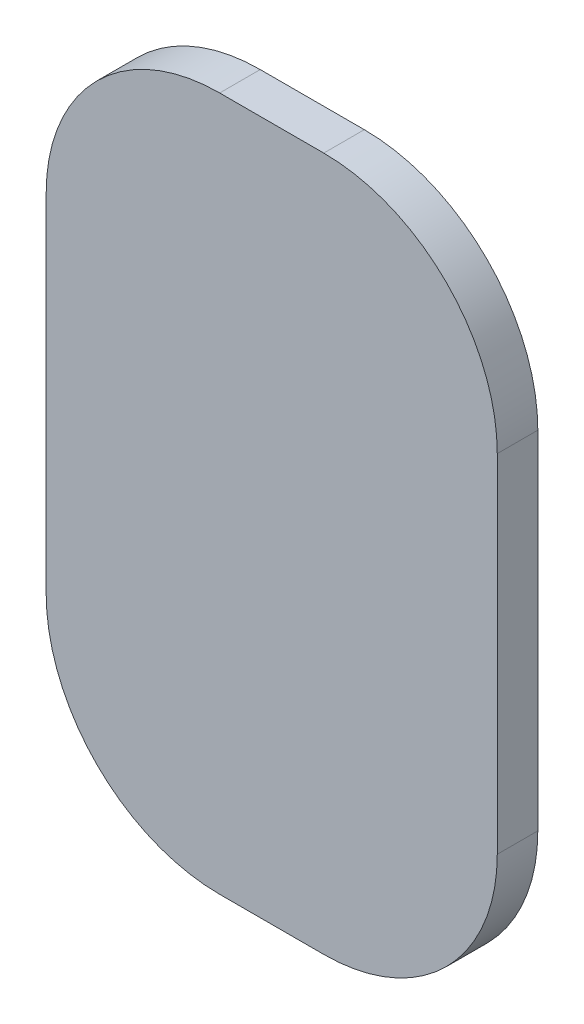
ISO-10303-21;
HEADER;
FILE_DESCRIPTION(('STEP AP214'),'2;1');
FILE_NAME('part.step','',(''),(''),'','','');
FILE_SCHEMA(('AUTOMOTIVE_DESIGN { 1 0 10303 214 1 1 1 1 }'));
ENDSEC;
DATA;
#1=APPLICATION_CONTEXT('core data for automotive mechanical design processes');
#2=APPLICATION_PROTOCOL_DEFINITION('international standard','automotive_design',2000,#1);
#3=PRODUCT_CONTEXT('',#1,'mechanical');
#4=PRODUCT('Part','Part','',(#3));
#5=PRODUCT_RELATED_PRODUCT_CATEGORY('part','',(#4));
#6=PRODUCT_DEFINITION_FORMATION('','',#4);
#7=PRODUCT_DEFINITION_CONTEXT('part definition',#1,'design');
#8=PRODUCT_DEFINITION('design','',#6,#7);
#9=PRODUCT_DEFINITION_SHAPE('','',#8);
#10=(LENGTH_UNIT() NAMED_UNIT(*) SI_UNIT(.MILLI.,.METRE.));
#11=(NAMED_UNIT(*) PLANE_ANGLE_UNIT() SI_UNIT($,.RADIAN.));
#12=(NAMED_UNIT(*) SI_UNIT($,.STERADIAN.) SOLID_ANGLE_UNIT());
#13=UNCERTAINTY_MEASURE_WITH_UNIT(LENGTH_MEASURE(1.E-05),#10,'distance_accuracy_value','');
#14=(GEOMETRIC_REPRESENTATION_CONTEXT(3) GLOBAL_UNCERTAINTY_ASSIGNED_CONTEXT((#13)) GLOBAL_UNIT_ASSIGNED_CONTEXT((#10,
#11,#12)) REPRESENTATION_CONTEXT('',''));
#15=CARTESIAN_POINT('',(0.,0.,0.));
#16=DIRECTION('',(0.,0.,1.));
#17=DIRECTION('',(1.,0.,0.));
#18=AXIS2_PLACEMENT_3D('',#15,#16,#17);
#19=CARTESIAN_POINT('',(0.,0.,-1.1684));
#20=DIRECTION('',(-1.,0.,0.));
#21=DIRECTION('',(0.,-1.,0.));
#22=AXIS2_PLACEMENT_3D('',#19,#20,#21);
#23=PLANE('',#22);
#24=DIRECTION('',(0.,-1.,0.));
#25=VECTOR('',#24,1.);
#26=CARTESIAN_POINT('',(0.,0.,0.));
#27=LINE('',#26,#25);
#28=CARTESIAN_POINT('',(0.,15.,0.));
#29=VERTEX_POINT('',#28);
#30=CARTESIAN_POINT('',(0.,5.,0.));
#31=VERTEX_POINT('',#30);
#32=EDGE_CURVE('E162',#29,#31,#27,.T.);
#33=ORIENTED_EDGE('',*,*,#32,.F.);
#34=DIRECTION('',(0.,0.,1.));
#35=VECTOR('',#34,1.);
#36=CARTESIAN_POINT('',(0.,15.,-1.1684));
#37=LINE('',#36,#35);
#38=CARTESIAN_POINT('',(0.,15.,-1.1684));
#39=VERTEX_POINT('',#38);
#40=EDGE_CURVE('E142',#29,#39,#37,.F.);
#41=ORIENTED_EDGE('',*,*,#40,.T.);
#42=DIRECTION('',(0.,-1.,0.));
#43=VECTOR('',#42,1.);
#44=CARTESIAN_POINT('',(0.,0.,-1.1684));
#45=LINE('',#44,#43);
#46=CARTESIAN_POINT('',(0.,5.,-1.1684));
#47=VERTEX_POINT('',#46);
#48=EDGE_CURVE('E123',#39,#47,#45,.T.);
#49=ORIENTED_EDGE('',*,*,#48,.T.);
#50=DIRECTION('',(0.,0.,1.));
#51=VECTOR('',#50,1.);
#52=CARTESIAN_POINT('',(0.,5.,-1.1684));
#53=LINE('',#52,#51);
#54=EDGE_CURVE('E139',#47,#31,#53,.T.);
#55=ORIENTED_EDGE('',*,*,#54,.T.);
#56=EDGE_LOOP('',(#33,#41,#49,#55));
#57=FACE_BOUND('',#56,.T.);
#58=ADVANCED_FACE('F37',(#57),#23,.T.);
#59=CARTESIAN_POINT('',(0.,20.,-1.1684));
#60=DIRECTION('',(0.,1.,0.));
#61=DIRECTION('',(0.,0.,1.));
#62=AXIS2_PLACEMENT_3D('',#59,#60,#61);
#63=PLANE('',#62);
#64=DIRECTION('',(-1.,0.,0.));
#65=VECTOR('',#64,1.);
#66=CARTESIAN_POINT('',(0.,20.,-1.1684));
#67=LINE('',#66,#65);
#68=CARTESIAN_POINT('',(7.99999999999999,20.,-1.1684));
#69=VERTEX_POINT('',#68);
#70=CARTESIAN_POINT('',(4.99999999999999,20.,-1.1684));
#71=VERTEX_POINT('',#70);
#72=EDGE_CURVE('E127',#69,#71,#67,.T.);
#73=ORIENTED_EDGE('',*,*,#72,.T.);
#74=DIRECTION('',(0.,0.,1.));
#75=VECTOR('',#74,1.);
#76=CARTESIAN_POINT('',(5.,20.,-1.1684));
#77=LINE('',#76,#75);
#78=CARTESIAN_POINT('',(4.99999999999999,20.,0.));
#79=VERTEX_POINT('',#78);
#80=EDGE_CURVE('E114',#71,#79,#77,.T.);
#81=ORIENTED_EDGE('',*,*,#80,.T.);
#82=DIRECTION('',(-1.,0.,0.));
#83=VECTOR('',#82,1.);
#84=CARTESIAN_POINT('',(0.,20.,0.));
#85=LINE('',#84,#83);
#86=CARTESIAN_POINT('',(7.99999999999999,20.,0.));
#87=VERTEX_POINT('',#86);
#88=EDGE_CURVE('E106',#87,#79,#85,.T.);
#89=ORIENTED_EDGE('',*,*,#88,.F.);
#90=DIRECTION('',(0.,0.,1.));
#91=VECTOR('',#90,1.);
#92=CARTESIAN_POINT('',(8.,20.,-1.1684));
#93=LINE('',#92,#91);
#94=EDGE_CURVE('E120',#87,#69,#93,.F.);
#95=ORIENTED_EDGE('',*,*,#94,.T.);
#96=EDGE_LOOP('',(#73,#81,#89,#95));
#97=FACE_BOUND('',#96,.T.);
#98=ADVANCED_FACE('F119',(#97),#63,.T.);
#99=CARTESIAN_POINT('',(13.,0.,-1.1684));
#100=DIRECTION('',(1.,0.,0.));
#101=DIRECTION('',(0.,1.,0.));
#102=AXIS2_PLACEMENT_3D('',#99,#100,#101);
#103=PLANE('',#102);
#104=DIRECTION('',(0.,1.,0.));
#105=VECTOR('',#104,1.);
#106=CARTESIAN_POINT('',(13.,0.,0.));
#107=LINE('',#106,#105);
#108=CARTESIAN_POINT('',(13.,5.,0.));
#109=VERTEX_POINT('',#108);
#110=CARTESIAN_POINT('',(13.,15.,0.));
#111=VERTEX_POINT('',#110);
#112=EDGE_CURVE('E108',#109,#111,#107,.T.);
#113=ORIENTED_EDGE('',*,*,#112,.F.);
#114=DIRECTION('',(0.,0.,1.));
#115=VECTOR('',#114,1.);
#116=CARTESIAN_POINT('',(13.,5.,-1.1684));
#117=LINE('',#116,#115);
#118=CARTESIAN_POINT('',(13.,5.,-1.1684));
#119=VERTEX_POINT('',#118);
#120=EDGE_CURVE('E11',#109,#119,#117,.F.);
#121=ORIENTED_EDGE('',*,*,#120,.T.);
#122=DIRECTION('',(0.,1.,0.));
#123=VECTOR('',#122,1.);
#124=CARTESIAN_POINT('',(13.,0.,-1.1684));
#125=LINE('',#124,#123);
#126=CARTESIAN_POINT('',(13.,15.,-1.1684));
#127=VERTEX_POINT('',#126);
#128=EDGE_CURVE('E130',#119,#127,#125,.T.);
#129=ORIENTED_EDGE('',*,*,#128,.T.);
#130=DIRECTION('',(0.,0.,1.));
#131=VECTOR('',#130,1.);
#132=CARTESIAN_POINT('',(13.,15.,-1.1684));
#133=LINE('',#132,#131);
#134=EDGE_CURVE('E45',#127,#111,#133,.T.);
#135=ORIENTED_EDGE('',*,*,#134,.T.);
#136=EDGE_LOOP('',(#113,#121,#129,#135));
#137=FACE_BOUND('',#136,.T.);
#138=ADVANCED_FACE('F155',(#137),#103,.T.);
#139=CARTESIAN_POINT('',(0.,0.,-1.1684));
#140=DIRECTION('',(0.,-1.,0.));
#141=DIRECTION('',(0.,0.,-1.));
#142=AXIS2_PLACEMENT_3D('',#139,#140,#141);
#143=PLANE('',#142);
#144=DIRECTION('',(1.,0.,0.));
#145=VECTOR('',#144,1.);
#146=CARTESIAN_POINT('',(0.,0.,0.));
#147=LINE('',#146,#145);
#148=CARTESIAN_POINT('',(5.,0.,0.));
#149=VERTEX_POINT('',#148);
#150=CARTESIAN_POINT('',(7.99999999999999,0.,0.));
#151=VERTEX_POINT('',#150);
#152=EDGE_CURVE('E165',#149,#151,#147,.T.);
#153=ORIENTED_EDGE('',*,*,#152,.F.);
#154=DIRECTION('',(0.,0.,1.));
#155=VECTOR('',#154,1.);
#156=CARTESIAN_POINT('',(5.,0.,-1.1684));
#157=LINE('',#156,#155);
#158=CARTESIAN_POINT('',(5.,0.,-1.1684));
#159=VERTEX_POINT('',#158);
#160=EDGE_CURVE('E59',#149,#159,#157,.F.);
#161=ORIENTED_EDGE('',*,*,#160,.T.);
#162=DIRECTION('',(1.,0.,0.));
#163=VECTOR('',#162,1.);
#164=CARTESIAN_POINT('',(0.,0.,-1.1684));
#165=LINE('',#164,#163);
#166=CARTESIAN_POINT('',(7.99999999999999,0.,-1.1684));
#167=VERTEX_POINT('',#166);
#168=EDGE_CURVE('E157',#159,#167,#165,.T.);
#169=ORIENTED_EDGE('',*,*,#168,.T.);
#170=DIRECTION('',(0.,0.,1.));
#171=VECTOR('',#170,1.);
#172=CARTESIAN_POINT('',(8.,0.,-1.1684));
#173=LINE('',#172,#171);
#174=EDGE_CURVE('E150',#167,#151,#173,.T.);
#175=ORIENTED_EDGE('',*,*,#174,.T.);
#176=EDGE_LOOP('',(#153,#161,#169,#175));
#177=FACE_BOUND('',#176,.T.);
#178=ADVANCED_FACE('F167',(#177),#143,.T.);
#179=CARTESIAN_POINT('',(0.,0.,-1.1684));
#180=DIRECTION('',(0.,0.,-1.));
#181=DIRECTION('',(-1.,0.,0.));
#182=AXIS2_PLACEMENT_3D('',#179,#180,#181);
#183=PLANE('',#182);
#184=ORIENTED_EDGE('',*,*,#48,.F.);
#185=CARTESIAN_POINT('',(5.,15.,-1.1684));
#186=DIRECTION('',(0.,0.,-1.));
#187=DIRECTION('',(-1.,0.,0.));
#188=AXIS2_PLACEMENT_3D('',#185,#186,#187);
#189=CIRCLE('',#188,5.);
#190=EDGE_CURVE('E148',#39,#71,#189,.T.);
#191=ORIENTED_EDGE('',*,*,#190,.T.);
#192=ORIENTED_EDGE('',*,*,#72,.F.);
#193=CARTESIAN_POINT('',(8.,15.,-1.1684));
#194=DIRECTION('',(0.,0.,-1.));
#195=DIRECTION('',(-1.,0.,0.));
#196=AXIS2_PLACEMENT_3D('',#193,#194,#195);
#197=CIRCLE('',#196,5.);
#198=EDGE_CURVE('E126',#69,#127,#197,.T.);
#199=ORIENTED_EDGE('',*,*,#198,.T.);
#200=ORIENTED_EDGE('',*,*,#128,.F.);
#201=CARTESIAN_POINT('',(8.,5.,-1.1684));
#202=DIRECTION('',(0.,0.,-1.));
#203=DIRECTION('',(-1.,0.,0.));
#204=AXIS2_PLACEMENT_3D('',#201,#202,#203);
#205=CIRCLE('',#204,5.);
#206=EDGE_CURVE('E52',#119,#167,#205,.T.);
#207=ORIENTED_EDGE('',*,*,#206,.T.);
#208=ORIENTED_EDGE('',*,*,#168,.F.);
#209=CARTESIAN_POINT('',(5.,5.,-1.1684));
#210=DIRECTION('',(0.,0.,-1.));
#211=DIRECTION('',(-1.,0.,0.));
#212=AXIS2_PLACEMENT_3D('',#209,#210,#211);
#213=CIRCLE('',#212,5.);
#214=EDGE_CURVE('E146',#159,#47,#213,.T.);
#215=ORIENTED_EDGE('',*,*,#214,.T.);
#216=EDGE_LOOP('',(#184,#191,#192,#199,#200,#207,#208,#215));
#217=FACE_BOUND('',#216,.T.);
#218=ADVANCED_FACE('F175',(#217),#183,.T.);
#219=CARTESIAN_POINT('',(0.,0.,0.));
#220=DIRECTION('',(0.,0.,-1.));
#221=DIRECTION('',(-1.,0.,0.));
#222=AXIS2_PLACEMENT_3D('',#219,#220,#221);
#223=PLANE('',#222);
#224=ORIENTED_EDGE('',*,*,#88,.T.);
#225=CARTESIAN_POINT('',(5.,15.,0.));
#226=DIRECTION('',(0.,0.,-1.));
#227=DIRECTION('',(-1.,0.,0.));
#228=AXIS2_PLACEMENT_3D('',#225,#226,#227);
#229=CIRCLE('',#228,5.);
#230=EDGE_CURVE('E137',#79,#29,#229,.F.);
#231=ORIENTED_EDGE('',*,*,#230,.T.);
#232=ORIENTED_EDGE('',*,*,#32,.T.);
#233=CARTESIAN_POINT('',(5.,5.,0.));
#234=DIRECTION('',(0.,0.,-1.));
#235=DIRECTION('',(-1.,0.,0.));
#236=AXIS2_PLACEMENT_3D('',#233,#234,#235);
#237=CIRCLE('',#236,5.);
#238=EDGE_CURVE('E135',#31,#149,#237,.F.);
#239=ORIENTED_EDGE('',*,*,#238,.T.);
#240=ORIENTED_EDGE('',*,*,#152,.T.);
#241=CARTESIAN_POINT('',(8.,5.,0.));
#242=DIRECTION('',(0.,0.,-1.));
#243=DIRECTION('',(-1.,0.,0.));
#244=AXIS2_PLACEMENT_3D('',#241,#242,#243);
#245=CIRCLE('',#244,5.);
#246=EDGE_CURVE('E113',#151,#109,#245,.F.);
#247=ORIENTED_EDGE('',*,*,#246,.T.);
#248=ORIENTED_EDGE('',*,*,#112,.T.);
#249=CARTESIAN_POINT('',(8.,15.,0.));
#250=DIRECTION('',(0.,0.,-1.));
#251=DIRECTION('',(-1.,0.,0.));
#252=AXIS2_PLACEMENT_3D('',#249,#250,#251);
#253=CIRCLE('',#252,5.);
#254=EDGE_CURVE('E103',#111,#87,#253,.F.);
#255=ORIENTED_EDGE('',*,*,#254,.T.);
#256=EDGE_LOOP('',(#224,#231,#232,#239,#240,#247,#248,#255));
#257=FACE_BOUND('',#256,.T.);
#258=ADVANCED_FACE('F105',(#257),#223,.F.);
#259=CARTESIAN_POINT('',(5.,15.,-1.1684));
#260=DIRECTION('',(0.,0.,1.));
#261=DIRECTION('',(1.,0.,0.));
#262=AXIS2_PLACEMENT_3D('',#259,#260,#261);
#263=CYLINDRICAL_SURFACE('',#262,5.);
#264=ORIENTED_EDGE('',*,*,#190,.F.);
#265=ORIENTED_EDGE('',*,*,#40,.F.);
#266=ORIENTED_EDGE('',*,*,#230,.F.);
#267=ORIENTED_EDGE('',*,*,#80,.F.);
#268=EDGE_LOOP('',(#264,#265,#266,#267));
#269=FACE_BOUND('',#268,.T.);
#270=ADVANCED_FACE('F181',(#269),#263,.T.);
#271=CARTESIAN_POINT('',(5.,5.,-1.1684));
#272=DIRECTION('',(0.,0.,1.));
#273=DIRECTION('',(1.,0.,0.));
#274=AXIS2_PLACEMENT_3D('',#271,#272,#273);
#275=CYLINDRICAL_SURFACE('',#274,5.);
#276=ORIENTED_EDGE('',*,*,#214,.F.);
#277=ORIENTED_EDGE('',*,*,#160,.F.);
#278=ORIENTED_EDGE('',*,*,#238,.F.);
#279=ORIENTED_EDGE('',*,*,#54,.F.);
#280=EDGE_LOOP('',(#276,#277,#278,#279));
#281=FACE_BOUND('',#280,.T.);
#282=ADVANCED_FACE('F171',(#281),#275,.T.);
#283=CARTESIAN_POINT('',(8.,5.,-1.1684));
#284=DIRECTION('',(0.,0.,1.));
#285=DIRECTION('',(1.,0.,0.));
#286=AXIS2_PLACEMENT_3D('',#283,#284,#285);
#287=CYLINDRICAL_SURFACE('',#286,5.);
#288=ORIENTED_EDGE('',*,*,#206,.F.);
#289=ORIENTED_EDGE('',*,*,#120,.F.);
#290=ORIENTED_EDGE('',*,*,#246,.F.);
#291=ORIENTED_EDGE('',*,*,#174,.F.);
#292=EDGE_LOOP('',(#288,#289,#290,#291));
#293=FACE_BOUND('',#292,.T.);
#294=ADVANCED_FACE('F188',(#293),#287,.T.);
#295=CARTESIAN_POINT('',(8.,15.,-1.1684));
#296=DIRECTION('',(0.,0.,1.));
#297=DIRECTION('',(1.,0.,0.));
#298=AXIS2_PLACEMENT_3D('',#295,#296,#297);
#299=CYLINDRICAL_SURFACE('',#298,5.);
#300=ORIENTED_EDGE('',*,*,#198,.F.);
#301=ORIENTED_EDGE('',*,*,#94,.F.);
#302=ORIENTED_EDGE('',*,*,#254,.F.);
#303=ORIENTED_EDGE('',*,*,#134,.F.);
#304=EDGE_LOOP('',(#300,#301,#302,#303));
#305=FACE_BOUND('',#304,.T.);
#306=ADVANCED_FACE('F39',(#305),#299,.T.);
#307=CLOSED_SHELL('',(#58,#98,#138,#178,#218,#258,#270,#282,#294,#306));
#308=MANIFOLD_SOLID_BREP('B2',#307);
#309=ADVANCED_BREP_SHAPE_REPRESENTATION('',(#18,#308),#14);
#310=SHAPE_DEFINITION_REPRESENTATION(#9,#309);
ENDSEC;
END-ISO-10303-21;
